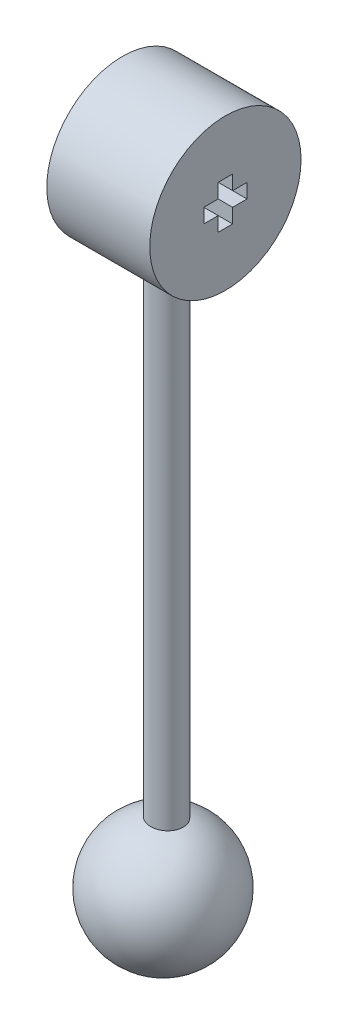
ISO-10303-21;
HEADER;
FILE_DESCRIPTION(('STEP AP214'),'2;1');
FILE_NAME('part.step','',(''),(''),'','','');
FILE_SCHEMA(('AUTOMOTIVE_DESIGN { 1 0 10303 214 1 1 1 1 }'));
ENDSEC;
DATA;
#1=APPLICATION_CONTEXT('core data for automotive mechanical design processes');
#2=APPLICATION_PROTOCOL_DEFINITION('international standard','automotive_design',2000,#1);
#3=PRODUCT_CONTEXT('',#1,'mechanical');
#4=PRODUCT('Part','Part','',(#3));
#5=PRODUCT_RELATED_PRODUCT_CATEGORY('part','',(#4));
#6=PRODUCT_DEFINITION_FORMATION('','',#4);
#7=PRODUCT_DEFINITION_CONTEXT('part definition',#1,'design');
#8=PRODUCT_DEFINITION('design','',#6,#7);
#9=PRODUCT_DEFINITION_SHAPE('','',#8);
#10=(LENGTH_UNIT() NAMED_UNIT(*) SI_UNIT(.MILLI.,.METRE.));
#11=(NAMED_UNIT(*) PLANE_ANGLE_UNIT() SI_UNIT($,.RADIAN.));
#12=(NAMED_UNIT(*) SI_UNIT($,.STERADIAN.) SOLID_ANGLE_UNIT());
#13=UNCERTAINTY_MEASURE_WITH_UNIT(LENGTH_MEASURE(1.E-05),#10,'distance_accuracy_value','');
#14=(GEOMETRIC_REPRESENTATION_CONTEXT(3) GLOBAL_UNCERTAINTY_ASSIGNED_CONTEXT((#13)) GLOBAL_UNIT_ASSIGNED_CONTEXT((#10,
#11,#12)) REPRESENTATION_CONTEXT('',''));
#15=CARTESIAN_POINT('',(0.,0.,0.));
#16=DIRECTION('',(0.,0.,1.));
#17=DIRECTION('',(1.,0.,0.));
#18=AXIS2_PLACEMENT_3D('',#15,#16,#17);
#19=CARTESIAN_POINT('',(-11.0722496385316,74.168,-21.5543244105927));
#20=DIRECTION('',(0.,-1.,0.));
#21=DIRECTION('',(0.,0.,-1.));
#22=AXIS2_PLACEMENT_3D('',#19,#20,#21);
#23=CYLINDRICAL_SURFACE('',#22,2.02572946275032);
#24=CARTESIAN_POINT('',(-12.4821164353175,7.6224074137577,-23.0089224552701));
#25=CARTESIAN_POINT('',(-12.5638423965474,7.62711954625664,-22.9297026989687));
#26=CARTESIAN_POINT('',(-12.6389387727303,7.6317342641124,-22.8435188043488));
#27=CARTESIAN_POINT('',(-12.7736573457487,7.64063602777816,-22.6596785154117));
#28=CARTESIAN_POINT('',(-12.8332608790463,7.64492267403114,-22.5620084879984));
#29=CARTESIAN_POINT('',(-12.935196267457,7.65304269814887,-22.3580620934006));
#30=CARTESIAN_POINT('',(-12.9775357963487,7.65687627686098,-22.2517895752194));
#31=CARTESIAN_POINT('',(-13.043750139669,7.66398397736629,-22.033653461523));
#32=CARTESIAN_POINT('',(-13.067629563174,7.66725823864943,-21.9217912690555));
#33=CARTESIAN_POINT('',(-13.0962498632644,7.67315616433629,-21.6956823191641));
#34=CARTESIAN_POINT('',(-13.1010000210248,7.675780143665,-21.5814367451666));
#35=CARTESIAN_POINT('',(-13.0912432020006,7.68030683834685,-21.3537520720783));
#36=CARTESIAN_POINT('',(-13.076735558985,7.6822095287438,-21.2403130010255));
#37=CARTESIAN_POINT('',(-13.0288895317924,7.68523949857679,-21.0175704455225));
#38=CARTESIAN_POINT('',(-12.9955674874739,7.68636744897449,-20.9082634602256));
#39=CARTESIAN_POINT('',(-12.9110477368848,7.68781942286316,-20.6967886649921));
#40=CARTESIAN_POINT('',(-12.8598501323067,7.68814345092747,-20.5946208144457));
#41=CARTESIAN_POINT('',(-12.7410651219781,7.68797868611838,-20.4003799705216));
#42=CARTESIAN_POINT('',(-12.6734864359791,7.68749032487672,-20.3083016441663));
#43=CARTESIAN_POINT('',(-12.5238453291869,7.68571508464123,-20.1367906777866));
#44=CARTESIAN_POINT('',(-12.4417829465696,7.68442820775208,-20.057358004432));
#45=CARTESIAN_POINT('',(-12.2655058308318,7.68109145534891,-19.9133887465834));
#46=CARTESIAN_POINT('',(-12.1712909943948,7.67904157334777,-19.8488522887456));
#47=CARTESIAN_POINT('',(-11.9733856177019,7.67423544826821,-19.7365011923586));
#48=CARTESIAN_POINT('',(-11.8696950462183,7.67147920286188,-19.6886866089196));
#49=CARTESIAN_POINT('',(-11.6557223004282,7.66533492041513,-19.6111061223166));
#50=CARTESIAN_POINT('',(-11.5454365634819,7.66194653976842,-19.5813500727215));
#51=CARTESIAN_POINT('',(-11.3214535468286,7.65463297711279,-19.5407625440552));
#52=CARTESIAN_POINT('',(-11.2077562534568,7.65070779295353,-19.5299311407956));
#53=CARTESIAN_POINT('',(-10.9800742250936,7.64242624992248,-19.527490478506));
#54=CARTESIAN_POINT('',(-10.8660893277451,7.63806952658417,-19.535897602565));
#55=CARTESIAN_POINT('',(-10.6411596654783,7.62904946110191,-19.5717224133296));
#56=CARTESIAN_POINT('',(-10.5302149152562,7.62438611747611,-19.5991401919171));
#57=CARTESIAN_POINT('',(-10.3144219479596,7.61487988748878,-19.6722339273317));
#58=CARTESIAN_POINT('',(-10.2095786403634,7.61003686154078,-19.7179243606366));
#59=CARTESIAN_POINT('',(-10.0090572031216,7.60031153439104,-19.8262652504825));
#60=CARTESIAN_POINT('',(-9.91337910018492,7.59542923307488,-19.8889157564461));
#61=CARTESIAN_POINT('',(-9.73386719890109,7.58576212186965,-20.029427908344));
#62=CARTESIAN_POINT('',(-9.65003802984346,7.58097735070623,-20.1072954713159));
#63=CARTESIAN_POINT('',(-9.49665088087891,7.57164409814127,-20.276018061785));
#64=CARTESIAN_POINT('',(-9.42709289973327,7.56709561671921,-20.366873088155));
#65=CARTESIAN_POINT('',(-9.30424065487672,7.55836671954665,-20.5589749687411));
#66=CARTESIAN_POINT('',(-9.2509432533397,7.55418623289461,-20.6602198129743));
#67=CARTESIAN_POINT('',(-9.16211569030104,7.54631344619923,-20.8702425606936));
#68=CARTESIAN_POINT('',(-9.12658546892084,7.54262114451066,-20.9790204387906));
#69=CARTESIAN_POINT('',(-9.07432939969227,7.53583475795514,-21.2009403590051));
#70=CARTESIAN_POINT('',(-9.05759038631371,7.53274025551707,-21.3140792881192));
#71=CARTESIAN_POINT('',(-9.04335665549502,7.5272368832621,-21.541577940737));
#72=CARTESIAN_POINT('',(-9.04586185056505,7.52482801032819,-21.6559376586882));
#73=CARTESIAN_POINT('',(-9.07004181037368,7.52076863370838,-21.8825213499259));
#74=CARTESIAN_POINT('',(-9.09169925906325,7.5191174470265,-21.9947471589308));
#75=CARTESIAN_POINT('',(-9.15354999341144,7.51661894110506,-22.2139783281134));
#76=CARTESIAN_POINT('',(-9.19374317729627,7.51577161745184,-22.3209837169513));
#77=CARTESIAN_POINT('',(-9.29149075329455,7.51490618407932,-22.5266580758729));
#78=CARTESIAN_POINT('',(-9.34903292516787,7.51488749205784,-22.6253328514361));
#79=CARTESIAN_POINT('',(-9.47985434473788,7.51567839852983,-22.8116278996702));
#80=CARTESIAN_POINT('',(-9.55313359033489,7.51648799691278,-22.8992481738159));
#81=CARTESIAN_POINT('',(-9.71333109526263,7.51891135305674,-23.0609329224399));
#82=CARTESIAN_POINT('',(-9.80024682391217,7.52052496172883,-23.1349999066461));
#83=CARTESIAN_POINT('',(-9.98525774710697,7.52450874881446,-23.2675012794572));
#84=CARTESIAN_POINT('',(-10.0833529807409,7.52687892987339,-23.3259356134008));
#85=CARTESIAN_POINT('',(-10.2879824453663,7.5323075167383,-23.4255430672766));
#86=CARTESIAN_POINT('',(-10.3945203459058,7.53536622288197,-23.4667086319886));
#87=CARTESIAN_POINT('',(-10.6129701023311,7.54208178977213,-23.5305813848089));
#88=CARTESIAN_POINT('',(-10.7248817694089,7.54573862951395,-23.5532892209306));
#89=CARTESIAN_POINT('',(-10.9509927645772,7.55354713879281,-23.5796247857204));
#90=CARTESIAN_POINT('',(-11.0651936936089,7.55769916543813,-23.5832386584889));
#91=CARTESIAN_POINT('',(-11.2925993070828,7.56637719285383,-23.5712506455019));
#92=CARTESIAN_POINT('',(-11.4058037320597,7.57090328801111,-23.5556438960051));
#93=CARTESIAN_POINT('',(-11.6281192008504,7.58020421432299,-23.5056300053598));
#94=CARTESIAN_POINT('',(-11.7372245318791,7.58497937196866,-23.4711975956907));
#95=CARTESIAN_POINT('',(-11.9480007488603,7.59463273665733,-23.3845144566691));
#96=CARTESIAN_POINT('',(-12.0496803779094,7.59951081350204,-23.332285106161));
#97=CARTESIAN_POINT('',(-12.2066160369226,7.60741149428279,-23.2341706354058));
#98=CARTESIAN_POINT('',(-12.2650136305271,7.61044582072619,-23.1932165531621));
#99=CARTESIAN_POINT('',(-12.377179249311,7.61646863186706,-23.105392470232));
#100=CARTESIAN_POINT('',(-12.4309472723515,7.61945711654337,-23.0585224668125));
#101=CARTESIAN_POINT('',(-12.4821164353175,7.6224074137577,-23.0089224552701));
#102=B_SPLINE_CURVE_WITH_KNOTS('',3,(#24,#25,#26,#27,#28,#29,#30,#31,#32,#33,#34,#35,#36,#37,
#38,#39,#40,#41,#42,#43,#44,#45,#46,#47,#48,#49,#50,#51,#52,#53,#54,#55,#56,#57,#58,#59,#60,#61,
#62,#63,#64,#65,#66,#67,#68,#69,#70,#71,#72,#73,#74,#75,#76,#77,#78,#79,#80,#81,#82,#83,#84,#85,
#86,#87,#88,#89,#90,#91,#92,#93,#94,#95,#96,#97,#98,#99,#100,#101),.UNSPECIFIED.,.T.,.F.,(4,2,2,
2,2,2,2,2,2,2,2,2,2,2,2,2,2,2,2,2,2,2,2,2,2,2,2,2,2,2,2,2,2,2,2,2,2,2,4),(0.,0.34149121521636,
0.683391922865119,1.02514049095714,1.36680370447542,1.70830112917593,2.04981036841789,
2.39102347023572,2.73223463095599,3.07326456017766,3.41429359053295,3.75532552040612,
4.09635857420648,4.43757754445413,4.7787978816139,5.12030890231436,5.46182157360905,
5.80360534539444,6.14539011316535,6.48730804675198,6.8292259506608,7.17107783241386,
7.51292856205714,7.85453963385242,8.19614915258422,8.53745012870706,8.87874923087752,
9.21980848899675,9.5608677016112,9.90186369459538,10.2428608798959,10.5840070989019,
10.9251413404386,11.2665230985936,11.6079912604955,11.9499188832369,12.2914371998815,
12.5052470016512,12.7190569022003),.UNSPECIFIED.);
#103=CARTESIAN_POINT('',(-12.4821164353175,7.6224074137577,-23.0089224552701));
#104=VERTEX_POINT('',#103);
#105=EDGE_CURVE('E229',#104,#104,#102,.T.);
#106=ORIENTED_EDGE('',*,*,#105,.T.);
#107=EDGE_LOOP('',(#106));
#108=FACE_BOUND('',#107,.T.);
#109=CARTESIAN_POINT('',(-11.0722496385316,67.7242169089415,-23.580053873343));
#110=CARTESIAN_POINT('',(-11.1845883612044,67.724214638846,-23.5800499806864));
#111=CARTESIAN_POINT('',(-11.2969740754876,67.7221165265859,-23.5706773219444));
#112=CARTESIAN_POINT('',(-11.5185510207202,67.7139659092303,-23.5334744459653));
#113=CARTESIAN_POINT('',(-11.6277398583732,67.7079105168597,-23.5056307518343));
#114=CARTESIAN_POINT('',(-11.8396857558684,67.6925627178645,-23.4324025302527));
#115=CARTESIAN_POINT('',(-11.9424496703365,67.6832738329878,-23.3870370807013));
#116=CARTESIAN_POINT('',(-12.1389098086265,67.6625099061851,-23.2801074877265));
#117=CARTESIAN_POINT('',(-12.2326062487158,67.6510349164191,-23.2185437307775));
#118=CARTESIAN_POINT('',(-12.4098322174115,67.6269784519804,-23.0798734186544));
#119=CARTESIAN_POINT('',(-12.4931889405506,67.6143830077749,-23.0025483969894));
#120=CARTESIAN_POINT('',(-12.6458562941506,67.589627183275,-22.8350221769775));
#121=CARTESIAN_POINT('',(-12.7151658431425,67.5774668365373,-22.7448199881488));
#122=CARTESIAN_POINT('',(-12.8384537468725,67.5547993536909,-22.5529426802655));
#123=CARTESIAN_POINT('',(-12.8922660807111,67.5443106216906,-22.4511585258061));
#124=CARTESIAN_POINT('',(-12.9819581788138,67.5263258789966,-22.2397263653375));
#125=CARTESIAN_POINT('',(-13.0178399239781,67.5188295377338,-22.1300792295305));
#126=CARTESIAN_POINT('',(-13.0701093130078,67.5077729258442,-21.9078300478554));
#127=CARTESIAN_POINT('',(-13.0867893604549,67.504153675686,-21.7952997541579));
#128=CARTESIAN_POINT('',(-13.1010959129492,67.5010547517967,-21.5689837874328));
#129=CARTESIAN_POINT('',(-13.0987245656993,67.5015746114552,-21.4551982573548));
#130=CARTESIAN_POINT('',(-13.0752137918608,67.5066501995593,-21.2316169125722));
#131=CARTESIAN_POINT('',(-13.0543895200586,67.5111381546512,-21.121786192921));
#132=CARTESIAN_POINT('',(-12.995066013139,67.5235685153916,-20.9072163607895));
#133=CARTESIAN_POINT('',(-12.9565659869448,67.5315110756498,-20.8024774764259));
#134=CARTESIAN_POINT('',(-12.8627038524144,67.5500674518694,-20.6001873457765));
#135=CARTESIAN_POINT('',(-12.8072219101778,67.5607001554113,-20.5026935056594));
#136=CARTESIAN_POINT('',(-12.6810601668257,67.5834703746893,-20.3182848819182));
#137=CARTESIAN_POINT('',(-12.6103783249948,67.5956080923937,-20.2313715212692));
#138=CARTESIAN_POINT('',(-12.4541061703012,67.6203466625691,-20.0687170076721));
#139=CARTESIAN_POINT('',(-12.3682400304646,67.6329519086925,-19.9932412966741));
#140=CARTESIAN_POINT('',(-12.1849392182354,67.6569715587754,-19.8577119863653));
#141=CARTESIAN_POINT('',(-12.0875042420013,67.6683859314433,-19.7976587922394));
#142=CARTESIAN_POINT('',(-11.8834068941629,67.6887427913179,-19.6945637212631));
#143=CARTESIAN_POINT('',(-11.7767187546139,67.6976780644646,-19.651571337537));
#144=CARTESIAN_POINT('',(-11.5573924857956,67.7119645792029,-19.5842048026585));
#145=CARTESIAN_POINT('',(-11.4447552873278,67.71731637969,-19.5598277480871));
#146=CARTESIAN_POINT('',(-11.219151881333,67.7237161946008,-19.5307941762343));
#147=CARTESIAN_POINT('',(-11.106237708823,67.7248484816802,-19.5257514513666));
#148=CARTESIAN_POINT('',(-10.8811820424108,67.7229082932674,-19.5344846626212));
#149=CARTESIAN_POINT('',(-10.7690404968195,67.7198361018561,-19.5482593273217));
#150=CARTESIAN_POINT('',(-10.5500537852391,67.7099126333532,-19.5939014182416));
#151=CARTESIAN_POINT('',(-10.4431622133197,67.7031056895605,-19.6255567203432));
#152=CARTESIAN_POINT('',(-10.2362001147538,67.6865195762689,-19.7058320957198));
#153=CARTESIAN_POINT('',(-10.1361302338023,67.6767401258897,-19.754453772259));
#154=CARTESIAN_POINT('',(-9.9439790784725,67.6551253561305,-19.8681347601941));
#155=CARTESIAN_POINT('',(-9.85204208672614,67.6432610891421,-19.9334323315014));
#156=CARTESIAN_POINT('',(-9.68028892834672,67.6188901185995,-20.0782992488178));
#157=CARTESIAN_POINT('',(-9.60047424492597,67.606383336681,-20.1578703386547));
#158=CARTESIAN_POINT('',(-9.45373552977528,67.5818591397067,-20.3307719246595));
#159=CARTESIAN_POINT('',(-9.38707460254791,67.5698548970058,-20.4243278971199));
#160=CARTESIAN_POINT('',(-9.27041573484677,67.547929454206,-20.6215344397434));
#161=CARTESIAN_POINT('',(-9.22041702267846,67.5380081576453,-20.7251845421192));
#162=CARTESIAN_POINT('',(-9.13886987230898,67.521422078045,-20.9389964853861));
#163=CARTESIAN_POINT('',(-9.10720559477892,67.5147368938676,-21.0491124912187));
#164=CARTESIAN_POINT('',(-9.06286386832617,67.5052881335313,-21.2732621537824));
#165=CARTESIAN_POINT('',(-9.05018370382146,67.5025239964891,-21.3872952478062));
#166=CARTESIAN_POINT('',(-9.04429067406729,67.5012451115381,-21.6135429929605));
#167=CARTESIAN_POINT('',(-9.05068473388677,67.502644560316,-21.7257471015227));
#168=CARTESIAN_POINT('',(-9.08188047775563,67.5093520879066,-21.9474408943459));
#169=CARTESIAN_POINT('',(-9.10668184073674,67.5146600985444,-22.0569306259178));
#170=CARTESIAN_POINT('',(-9.17380103347112,67.528582351397,-22.2697891167396));
#171=CARTESIAN_POINT('',(-9.21606390090289,67.5371862133619,-22.3731759289966));
#172=CARTESIAN_POINT('',(-9.31685251796394,67.5567807096875,-22.5714436664703));
#173=CARTESIAN_POINT('',(-9.37537981997752,67.5677715718574,-22.6663237786079));
#174=CARTESIAN_POINT('',(-9.50832176473615,67.5911972669218,-22.8468046436831));
#175=CARTESIAN_POINT('',(-9.58301328217531,67.6036552773598,-22.9321984618435));
#176=CARTESIAN_POINT('',(-9.74560397025006,67.6284851474938,-23.0893746372928));
#177=CARTESIAN_POINT('',(-9.83350631400841,67.640856985743,-23.1611537150471));
#178=CARTESIAN_POINT('',(-10.0214101666356,67.6642944626206,-23.2899690818343));
#179=CARTESIAN_POINT('',(-10.1215552912577,67.6753408333376,-23.3467995801119));
#180=CARTESIAN_POINT('',(-10.330192437704,67.6946350719407,-23.4427338701598));
#181=CARTESIAN_POINT('',(-10.4386772548005,67.7028853228144,-23.4818527662098));
#182=CARTESIAN_POINT('',(-10.6347796941244,67.7141164276749,-23.5342128965128));
#183=CARTESIAN_POINT('',(-10.7213281689145,67.717879127,-23.5513705053498));
#184=CARTESIAN_POINT('',(-10.8959913815776,67.7229301997577,-23.5742922517069));
#185=CARTESIAN_POINT('',(-10.9841060452399,67.7242186901116,-23.5800569276125));
#186=CARTESIAN_POINT('',(-11.0722496385316,67.7242169089415,-23.580053873343));
#187=B_SPLINE_CURVE_WITH_KNOTS('',3,(#109,#110,#111,#112,#113,#114,#115,#116,#117,#118,#119,
#120,#121,#122,#123,#124,#125,#126,#127,#128,#129,#130,#131,#132,#133,#134,#135,#136,#137,#138,
#139,#140,#141,#142,#143,#144,#145,#146,#147,#148,#149,#150,#151,#152,#153,#154,#155,#156,#157,
#158,#159,#160,#161,#162,#163,#164,#165,#166,#167,#168,#169,#170,#171,#172,#173,#174,#175,#176,
#177,#178,#179,#180,#181,#182,#183,#184,#185,#186),.UNSPECIFIED.,.T.,.F.,(4,2,2,2,2,2,2,2,2,2,2,
2,2,2,2,2,2,2,2,2,2,2,2,2,2,2,2,2,2,2,2,2,2,2,2,2,2,2,4),(0.,0.33669315718611,0.673632244062169,
1.01020549711112,1.34677072060881,1.68836418771724,2.02998394356962,2.37513780173853,
2.72025352024318,3.06004124076899,3.39979065686745,3.73384703236038,4.06791835997311,
4.40440366193191,4.7409341681298,5.08436095412644,5.42779676181023,5.77222171260797,
6.11659293272337,6.45404829340341,6.79148085459681,7.12499196722034,7.45853460403616,
7.79713909439498,8.13578498103307,8.48063828979525,8.82547562478599,9.16810976612567,
9.51069489068767,9.8462692401027,10.1818377364201,10.5163579389069,10.8509100811684,
11.1917244017453,11.5326207141016,11.8779897853453,12.223063771922,12.4872535948103,
12.7514309328199),.UNSPECIFIED.);
#188=CARTESIAN_POINT('',(-11.0722496385316,67.7242169089415,-23.580053873343));
#189=VERTEX_POINT('',#188);
#190=EDGE_CURVE('E11',#189,#189,#187,.T.);
#191=ORIENTED_EDGE('',*,*,#190,.F.);
#192=EDGE_LOOP('',(#191));
#193=FACE_BOUND('',#192,.T.);
#194=ADVANCED_FACE('F41',(#108,#193),#23,.T.);
#195=CARTESIAN_POINT('',(-11.3521452670296,0.,-21.3896799232409));
#196=DIRECTION('',(-0.707106781186548,0.,-0.707106781186548));
#197=DIRECTION('',(0.707106781186548,0.,-0.707106781186548));
#198=AXIS2_PLACEMENT_3D('',#195,#196,#197);
#199=SPHERICAL_SURFACE('',#198,7.874);
#200=ORIENTED_EDGE('',*,*,#105,.F.);
#201=EDGE_LOOP('',(#200));
#202=FACE_BOUND('',#201,.T.);
#203=ADVANCED_FACE('F43',(#202),#199,.T.);
#204=CARTESIAN_POINT('',(-3.81,76.835,-21.5543244105927));
#205=DIRECTION('',(-1.,0.,0.));
#206=DIRECTION('',(0.,0.,1.));
#207=AXIS2_PLACEMENT_3D('',#204,#205,#206);
#208=CYLINDRICAL_SURFACE('',#207,9.33327104441805);
#209=CARTESIAN_POINT('',(-16.51,76.835,-21.5543244105927));
#210=DIRECTION('',(1.,0.,0.));
#211=DIRECTION('',(0.,0.,-1.));
#212=AXIS2_PLACEMENT_3D('',#209,#210,#211);
#213=CIRCLE('',#212,9.33327104441805);
#214=CARTESIAN_POINT('',(-16.51,76.835,-30.8875954550107));
#215=VERTEX_POINT('',#214);
#216=EDGE_CURVE('E225',#215,#215,#213,.T.);
#217=ORIENTED_EDGE('',*,*,#216,.T.);
#218=EDGE_LOOP('',(#217));
#219=FACE_BOUND('',#218,.T.);
#220=CARTESIAN_POINT('',(-3.81,76.835,-21.5543244105927));
#221=DIRECTION('',(1.,0.,0.));
#222=DIRECTION('',(0.,0.,-1.));
#223=AXIS2_PLACEMENT_3D('',#220,#221,#222);
#224=CIRCLE('',#223,9.33327104441805);
#225=CARTESIAN_POINT('',(-3.81,76.835,-30.8875954550107));
#226=VERTEX_POINT('',#225);
#227=EDGE_CURVE('E226',#226,#226,#224,.T.);
#228=ORIENTED_EDGE('',*,*,#227,.F.);
#229=EDGE_LOOP('',(#228));
#230=FACE_BOUND('',#229,.T.);
#231=ORIENTED_EDGE('',*,*,#190,.T.);
#232=EDGE_LOOP('',(#231));
#233=FACE_BOUND('',#232,.T.);
#234=ADVANCED_FACE('F244',(#219,#230,#233),#208,.T.);
#235=CARTESIAN_POINT('',(-3.81,76.835,-21.5543244105927));
#236=DIRECTION('',(1.,0.,0.));
#237=DIRECTION('',(0.,0.,-1.));
#238=AXIS2_PLACEMENT_3D('',#235,#236,#237);
#239=PLANE('',#238);
#240=ORIENTED_EDGE('',*,*,#227,.T.);
#241=EDGE_LOOP('',(#240));
#242=FACE_BOUND('',#241,.T.);
#243=DIRECTION('',(0.,0.,-1.));
#244=VECTOR('',#243,1.);
#245=CARTESIAN_POINT('',(-3.81,74.168,-22.4433244105927));
#246=LINE('',#245,#244);
#247=CARTESIAN_POINT('',(-3.81,74.168,-20.6653244105927));
#248=VERTEX_POINT('',#247);
#249=CARTESIAN_POINT('',(-3.81,74.168,-22.4433244105927));
#250=VERTEX_POINT('',#249);
#251=EDGE_CURVE('E139',#248,#250,#246,.T.);
#252=ORIENTED_EDGE('',*,*,#251,.F.);
#253=DIRECTION('',(0.,-1.,0.));
#254=VECTOR('',#253,1.);
#255=CARTESIAN_POINT('',(-3.81,75.946,-20.6653244105927));
#256=LINE('',#255,#254);
#257=CARTESIAN_POINT('',(-3.81,75.946,-20.6653244105927));
#258=VERTEX_POINT('',#257);
#259=EDGE_CURVE('E145',#258,#248,#256,.T.);
#260=ORIENTED_EDGE('',*,*,#259,.F.);
#261=DIRECTION('',(0.,0.,-1.));
#262=VECTOR('',#261,1.);
#263=CARTESIAN_POINT('',(-3.81,75.946,-18.8873244105927));
#264=LINE('',#263,#262);
#265=CARTESIAN_POINT('',(-3.81,75.946,-18.8873244105927));
#266=VERTEX_POINT('',#265);
#267=EDGE_CURVE('E174',#266,#258,#264,.T.);
#268=ORIENTED_EDGE('',*,*,#267,.F.);
#269=DIRECTION('',(0.,-1.,0.));
#270=VECTOR('',#269,1.);
#271=CARTESIAN_POINT('',(-3.81,77.724,-18.8873244105927));
#272=LINE('',#271,#270);
#273=CARTESIAN_POINT('',(-3.81,77.724,-18.8873244105927));
#274=VERTEX_POINT('',#273);
#275=EDGE_CURVE('E172',#274,#266,#272,.T.);
#276=ORIENTED_EDGE('',*,*,#275,.F.);
#277=DIRECTION('',(0.,0.,1.));
#278=VECTOR('',#277,1.);
#279=CARTESIAN_POINT('',(-3.81,77.724,-18.8873244105927));
#280=LINE('',#279,#278);
#281=CARTESIAN_POINT('',(-3.81,77.724,-20.6653244105927));
#282=VERTEX_POINT('',#281);
#283=EDGE_CURVE('E170',#282,#274,#280,.T.);
#284=ORIENTED_EDGE('',*,*,#283,.F.);
#285=DIRECTION('',(0.,-1.,0.));
#286=VECTOR('',#285,1.);
#287=CARTESIAN_POINT('',(-3.81,79.502,-20.6653244105927));
#288=LINE('',#287,#286);
#289=CARTESIAN_POINT('',(-3.81,79.502,-20.6653244105927));
#290=VERTEX_POINT('',#289);
#291=EDGE_CURVE('E168',#290,#282,#288,.T.);
#292=ORIENTED_EDGE('',*,*,#291,.F.);
#293=DIRECTION('',(0.,0.,1.));
#294=VECTOR('',#293,1.);
#295=CARTESIAN_POINT('',(-3.81,79.502,-22.4433244105927));
#296=LINE('',#295,#294);
#297=CARTESIAN_POINT('',(-3.81,79.502,-22.4433244105927));
#298=VERTEX_POINT('',#297);
#299=EDGE_CURVE('E166',#298,#290,#296,.T.);
#300=ORIENTED_EDGE('',*,*,#299,.F.);
#301=DIRECTION('',(0.,1.,0.));
#302=VECTOR('',#301,1.);
#303=CARTESIAN_POINT('',(-3.81,79.502,-22.4433244105927));
#304=LINE('',#303,#302);
#305=CARTESIAN_POINT('',(-3.81,77.724,-22.4433244105927));
#306=VERTEX_POINT('',#305);
#307=EDGE_CURVE('E164',#306,#298,#304,.T.);
#308=ORIENTED_EDGE('',*,*,#307,.F.);
#309=DIRECTION('',(0.,0.,1.));
#310=VECTOR('',#309,1.);
#311=CARTESIAN_POINT('',(-3.81,77.724,-22.4433244105927));
#312=LINE('',#311,#310);
#313=CARTESIAN_POINT('',(-3.81,77.724,-24.2213244105927));
#314=VERTEX_POINT('',#313);
#315=EDGE_CURVE('E162',#314,#306,#312,.T.);
#316=ORIENTED_EDGE('',*,*,#315,.F.);
#317=DIRECTION('',(0.,1.,0.));
#318=VECTOR('',#317,1.);
#319=CARTESIAN_POINT('',(-3.81,77.724,-24.2213244105927));
#320=LINE('',#319,#318);
#321=CARTESIAN_POINT('',(-3.81,75.946,-24.2213244105927));
#322=VERTEX_POINT('',#321);
#323=EDGE_CURVE('E160',#322,#314,#320,.T.);
#324=ORIENTED_EDGE('',*,*,#323,.F.);
#325=DIRECTION('',(0.,0.,-1.));
#326=VECTOR('',#325,1.);
#327=CARTESIAN_POINT('',(-3.81,75.946,-22.4433244105927));
#328=LINE('',#327,#326);
#329=CARTESIAN_POINT('',(-3.81,75.946,-22.4433244105927));
#330=VERTEX_POINT('',#329);
#331=EDGE_CURVE('E156',#330,#322,#328,.T.);
#332=ORIENTED_EDGE('',*,*,#331,.F.);
#333=DIRECTION('',(0.,1.,0.));
#334=VECTOR('',#333,1.);
#335=CARTESIAN_POINT('',(-3.81,75.946,-22.4433244105927));
#336=LINE('',#335,#334);
#337=EDGE_CURVE('E154',#250,#330,#336,.T.);
#338=ORIENTED_EDGE('',*,*,#337,.F.);
#339=EDGE_LOOP('',(#252,#260,#268,#276,#284,#292,#300,#308,#316,#324,#332,#338));
#340=FACE_BOUND('',#339,.T.);
#341=ADVANCED_FACE('F152',(#242,#340),#239,.T.);
#342=CARTESIAN_POINT('',(-16.51,76.835,-21.5543244105927));
#343=DIRECTION('',(1.,0.,0.));
#344=DIRECTION('',(0.,0.,-1.));
#345=AXIS2_PLACEMENT_3D('',#342,#343,#344);
#346=PLANE('',#345);
#347=ORIENTED_EDGE('',*,*,#216,.F.);
#348=EDGE_LOOP('',(#347));
#349=FACE_BOUND('',#348,.T.);
#350=DIRECTION('',(0.,-1.,0.));
#351=VECTOR('',#350,1.);
#352=CARTESIAN_POINT('',(-16.51,75.946,-20.6653244105927));
#353=LINE('',#352,#351);
#354=CARTESIAN_POINT('',(-16.51,75.946,-20.6653244105927));
#355=VERTEX_POINT('',#354);
#356=CARTESIAN_POINT('',(-16.51,74.168,-20.6653244105927));
#357=VERTEX_POINT('',#356);
#358=EDGE_CURVE('E69',#355,#357,#353,.T.);
#359=ORIENTED_EDGE('',*,*,#358,.T.);
#360=DIRECTION('',(0.,0.,-1.));
#361=VECTOR('',#360,1.);
#362=CARTESIAN_POINT('',(-16.51,74.168,-22.4433244105927));
#363=LINE('',#362,#361);
#364=CARTESIAN_POINT('',(-16.51,74.168,-22.4433244105927));
#365=VERTEX_POINT('',#364);
#366=EDGE_CURVE('E142',#357,#365,#363,.T.);
#367=ORIENTED_EDGE('',*,*,#366,.T.);
#368=DIRECTION('',(0.,1.,0.));
#369=VECTOR('',#368,1.);
#370=CARTESIAN_POINT('',(-16.51,75.946,-22.4433244105927));
#371=LINE('',#370,#369);
#372=CARTESIAN_POINT('',(-16.51,75.946,-22.4433244105927));
#373=VERTEX_POINT('',#372);
#374=EDGE_CURVE('E178',#365,#373,#371,.T.);
#375=ORIENTED_EDGE('',*,*,#374,.T.);
#376=DIRECTION('',(0.,0.,-1.));
#377=VECTOR('',#376,1.);
#378=CARTESIAN_POINT('',(-16.51,75.946,-22.4433244105927));
#379=LINE('',#378,#377);
#380=CARTESIAN_POINT('',(-16.51,75.946,-24.2213244105927));
#381=VERTEX_POINT('',#380);
#382=EDGE_CURVE('E181',#373,#381,#379,.T.);
#383=ORIENTED_EDGE('',*,*,#382,.T.);
#384=DIRECTION('',(0.,1.,0.));
#385=VECTOR('',#384,1.);
#386=CARTESIAN_POINT('',(-16.51,77.724,-24.2213244105927));
#387=LINE('',#386,#385);
#388=CARTESIAN_POINT('',(-16.51,77.724,-24.2213244105927));
#389=VERTEX_POINT('',#388);
#390=EDGE_CURVE('E184',#381,#389,#387,.T.);
#391=ORIENTED_EDGE('',*,*,#390,.T.);
#392=DIRECTION('',(0.,0.,1.));
#393=VECTOR('',#392,1.);
#394=CARTESIAN_POINT('',(-16.51,77.724,-22.4433244105927));
#395=LINE('',#394,#393);
#396=CARTESIAN_POINT('',(-16.51,77.724,-22.4433244105927));
#397=VERTEX_POINT('',#396);
#398=EDGE_CURVE('E187',#389,#397,#395,.T.);
#399=ORIENTED_EDGE('',*,*,#398,.T.);
#400=DIRECTION('',(0.,1.,0.));
#401=VECTOR('',#400,1.);
#402=CARTESIAN_POINT('',(-16.51,79.502,-22.4433244105927));
#403=LINE('',#402,#401);
#404=CARTESIAN_POINT('',(-16.51,79.502,-22.4433244105927));
#405=VERTEX_POINT('',#404);
#406=EDGE_CURVE('E190',#397,#405,#403,.T.);
#407=ORIENTED_EDGE('',*,*,#406,.T.);
#408=DIRECTION('',(0.,0.,1.));
#409=VECTOR('',#408,1.);
#410=CARTESIAN_POINT('',(-16.51,79.502,-22.4433244105927));
#411=LINE('',#410,#409);
#412=CARTESIAN_POINT('',(-16.51,79.502,-20.6653244105927));
#413=VERTEX_POINT('',#412);
#414=EDGE_CURVE('E193',#405,#413,#411,.T.);
#415=ORIENTED_EDGE('',*,*,#414,.T.);
#416=DIRECTION('',(0.,-1.,0.));
#417=VECTOR('',#416,1.);
#418=CARTESIAN_POINT('',(-16.51,79.502,-20.6653244105927));
#419=LINE('',#418,#417);
#420=CARTESIAN_POINT('',(-16.51,77.724,-20.6653244105927));
#421=VERTEX_POINT('',#420);
#422=EDGE_CURVE('E196',#413,#421,#419,.T.);
#423=ORIENTED_EDGE('',*,*,#422,.T.);
#424=DIRECTION('',(0.,0.,1.));
#425=VECTOR('',#424,1.);
#426=CARTESIAN_POINT('',(-16.51,77.724,-18.8873244105927));
#427=LINE('',#426,#425);
#428=CARTESIAN_POINT('',(-16.51,77.724,-18.8873244105927));
#429=VERTEX_POINT('',#428);
#430=EDGE_CURVE('E199',#421,#429,#427,.T.);
#431=ORIENTED_EDGE('',*,*,#430,.T.);
#432=DIRECTION('',(0.,-1.,0.));
#433=VECTOR('',#432,1.);
#434=CARTESIAN_POINT('',(-16.51,77.724,-18.8873244105927));
#435=LINE('',#434,#433);
#436=CARTESIAN_POINT('',(-16.51,75.946,-18.8873244105927));
#437=VERTEX_POINT('',#436);
#438=EDGE_CURVE('E202',#429,#437,#435,.T.);
#439=ORIENTED_EDGE('',*,*,#438,.T.);
#440=DIRECTION('',(0.,0.,-1.));
#441=VECTOR('',#440,1.);
#442=CARTESIAN_POINT('',(-16.51,75.946,-18.8873244105927));
#443=LINE('',#442,#441);
#444=EDGE_CURVE('E150',#437,#355,#443,.T.);
#445=ORIENTED_EDGE('',*,*,#444,.T.);
#446=EDGE_LOOP('',(#359,#367,#375,#383,#391,#399,#407,#415,#423,#431,#439,#445));
#447=FACE_BOUND('',#446,.T.);
#448=ADVANCED_FACE('F249',(#349,#447),#346,.F.);
#449=CARTESIAN_POINT('',(-3.81,75.946,-20.6653244105927));
#450=DIRECTION('',(0.,0.,-1.));
#451=DIRECTION('',(0.,1.,0.));
#452=AXIS2_PLACEMENT_3D('',#449,#450,#451);
#453=PLANE('',#452);
#454=ORIENTED_EDGE('',*,*,#358,.F.);
#455=DIRECTION('',(-1.,0.,0.));
#456=VECTOR('',#455,1.);
#457=CARTESIAN_POINT('',(-3.81,75.946,-20.6653244105927));
#458=LINE('',#457,#456);
#459=EDGE_CURVE('E147',#258,#355,#458,.T.);
#460=ORIENTED_EDGE('',*,*,#459,.F.);
#461=ORIENTED_EDGE('',*,*,#259,.T.);
#462=DIRECTION('',(-1.,0.,0.));
#463=VECTOR('',#462,1.);
#464=CARTESIAN_POINT('',(-11.0722496385316,74.168,-20.6653244105927));
#465=LINE('',#464,#463);
#466=EDGE_CURVE('E54',#248,#357,#465,.T.);
#467=ORIENTED_EDGE('',*,*,#466,.T.);
#468=EDGE_LOOP('',(#454,#460,#461,#467));
#469=FACE_BOUND('',#468,.T.);
#470=ADVANCED_FACE('F146',(#469),#453,.T.);
#471=CARTESIAN_POINT('',(-3.81,75.946,-22.4433244105927));
#472=DIRECTION('',(0.,0.,1.));
#473=DIRECTION('',(0.,-1.,0.));
#474=AXIS2_PLACEMENT_3D('',#471,#472,#473);
#475=PLANE('',#474);
#476=ORIENTED_EDGE('',*,*,#374,.F.);
#477=DIRECTION('',(1.,0.,0.));
#478=VECTOR('',#477,1.);
#479=CARTESIAN_POINT('',(-11.0722496385316,74.168,-22.4433244105927));
#480=LINE('',#479,#478);
#481=EDGE_CURVE('E143',#365,#250,#480,.T.);
#482=ORIENTED_EDGE('',*,*,#481,.T.);
#483=ORIENTED_EDGE('',*,*,#337,.T.);
#484=DIRECTION('',(-1.,0.,0.));
#485=VECTOR('',#484,1.);
#486=CARTESIAN_POINT('',(-3.81,75.946,-22.4433244105927));
#487=LINE('',#486,#485);
#488=EDGE_CURVE('E223',#330,#373,#487,.T.);
#489=ORIENTED_EDGE('',*,*,#488,.T.);
#490=EDGE_LOOP('',(#476,#482,#483,#489));
#491=FACE_BOUND('',#490,.T.);
#492=ADVANCED_FACE('F258',(#491),#475,.T.);
#493=CARTESIAN_POINT('',(-3.81,75.946,-22.4433244105927));
#494=DIRECTION('',(0.,1.,0.));
#495=DIRECTION('',(0.,0.,1.));
#496=AXIS2_PLACEMENT_3D('',#493,#494,#495);
#497=PLANE('',#496);
#498=ORIENTED_EDGE('',*,*,#382,.F.);
#499=ORIENTED_EDGE('',*,*,#488,.F.);
#500=ORIENTED_EDGE('',*,*,#331,.T.);
#501=DIRECTION('',(-1.,0.,0.));
#502=VECTOR('',#501,1.);
#503=CARTESIAN_POINT('',(-3.81,75.946,-24.2213244105927));
#504=LINE('',#503,#502);
#505=EDGE_CURVE('E221',#322,#381,#504,.T.);
#506=ORIENTED_EDGE('',*,*,#505,.T.);
#507=EDGE_LOOP('',(#498,#499,#500,#506));
#508=FACE_BOUND('',#507,.T.);
#509=ADVANCED_FACE('F261',(#508),#497,.T.);
#510=CARTESIAN_POINT('',(-3.81,77.724,-24.2213244105927));
#511=DIRECTION('',(0.,0.,1.));
#512=DIRECTION('',(1.,0.,0.));
#513=AXIS2_PLACEMENT_3D('',#510,#511,#512);
#514=PLANE('',#513);
#515=ORIENTED_EDGE('',*,*,#390,.F.);
#516=ORIENTED_EDGE('',*,*,#505,.F.);
#517=ORIENTED_EDGE('',*,*,#323,.T.);
#518=DIRECTION('',(-1.,0.,0.));
#519=VECTOR('',#518,1.);
#520=CARTESIAN_POINT('',(-3.81,77.724,-24.2213244105927));
#521=LINE('',#520,#519);
#522=EDGE_CURVE('E219',#314,#389,#521,.T.);
#523=ORIENTED_EDGE('',*,*,#522,.T.);
#524=EDGE_LOOP('',(#515,#516,#517,#523));
#525=FACE_BOUND('',#524,.T.);
#526=ADVANCED_FACE('F265',(#525),#514,.T.);
#527=CARTESIAN_POINT('',(-3.81,77.724,-22.4433244105927));
#528=DIRECTION('',(0.,-1.,0.));
#529=DIRECTION('',(0.,0.,-1.));
#530=AXIS2_PLACEMENT_3D('',#527,#528,#529);
#531=PLANE('',#530);
#532=ORIENTED_EDGE('',*,*,#398,.F.);
#533=ORIENTED_EDGE('',*,*,#522,.F.);
#534=ORIENTED_EDGE('',*,*,#315,.T.);
#535=DIRECTION('',(-1.,0.,0.));
#536=VECTOR('',#535,1.);
#537=CARTESIAN_POINT('',(-3.81,77.724,-22.4433244105927));
#538=LINE('',#537,#536);
#539=EDGE_CURVE('E217',#306,#397,#538,.T.);
#540=ORIENTED_EDGE('',*,*,#539,.T.);
#541=EDGE_LOOP('',(#532,#533,#534,#540));
#542=FACE_BOUND('',#541,.T.);
#543=ADVANCED_FACE('F269',(#542),#531,.T.);
#544=CARTESIAN_POINT('',(-3.81,79.502,-22.4433244105927));
#545=DIRECTION('',(0.,0.,1.));
#546=DIRECTION('',(1.,0.,0.));
#547=AXIS2_PLACEMENT_3D('',#544,#545,#546);
#548=PLANE('',#547);
#549=ORIENTED_EDGE('',*,*,#406,.F.);
#550=ORIENTED_EDGE('',*,*,#539,.F.);
#551=ORIENTED_EDGE('',*,*,#307,.T.);
#552=DIRECTION('',(-1.,0.,0.));
#553=VECTOR('',#552,1.);
#554=CARTESIAN_POINT('',(-3.81,79.502,-22.4433244105927));
#555=LINE('',#554,#553);
#556=EDGE_CURVE('E215',#298,#405,#555,.T.);
#557=ORIENTED_EDGE('',*,*,#556,.T.);
#558=EDGE_LOOP('',(#549,#550,#551,#557));
#559=FACE_BOUND('',#558,.T.);
#560=ADVANCED_FACE('F273',(#559),#548,.T.);
#561=CARTESIAN_POINT('',(-3.81,79.502,-22.4433244105927));
#562=DIRECTION('',(0.,-1.,0.));
#563=DIRECTION('',(0.,0.,-1.));
#564=AXIS2_PLACEMENT_3D('',#561,#562,#563);
#565=PLANE('',#564);
#566=ORIENTED_EDGE('',*,*,#414,.F.);
#567=ORIENTED_EDGE('',*,*,#556,.F.);
#568=ORIENTED_EDGE('',*,*,#299,.T.);
#569=DIRECTION('',(-1.,0.,0.));
#570=VECTOR('',#569,1.);
#571=CARTESIAN_POINT('',(-3.81,79.502,-20.6653244105927));
#572=LINE('',#571,#570);
#573=EDGE_CURVE('E213',#290,#413,#572,.T.);
#574=ORIENTED_EDGE('',*,*,#573,.T.);
#575=EDGE_LOOP('',(#566,#567,#568,#574));
#576=FACE_BOUND('',#575,.T.);
#577=ADVANCED_FACE('F277',(#576),#565,.T.);
#578=CARTESIAN_POINT('',(-3.81,79.502,-20.6653244105927));
#579=DIRECTION('',(0.,0.,-1.));
#580=DIRECTION('',(-1.,0.,0.));
#581=AXIS2_PLACEMENT_3D('',#578,#579,#580);
#582=PLANE('',#581);
#583=ORIENTED_EDGE('',*,*,#422,.F.);
#584=ORIENTED_EDGE('',*,*,#573,.F.);
#585=ORIENTED_EDGE('',*,*,#291,.T.);
#586=DIRECTION('',(-1.,0.,0.));
#587=VECTOR('',#586,1.);
#588=CARTESIAN_POINT('',(-3.81,77.724,-20.6653244105927));
#589=LINE('',#588,#587);
#590=EDGE_CURVE('E211',#282,#421,#589,.T.);
#591=ORIENTED_EDGE('',*,*,#590,.T.);
#592=EDGE_LOOP('',(#583,#584,#585,#591));
#593=FACE_BOUND('',#592,.T.);
#594=ADVANCED_FACE('F281',(#593),#582,.T.);
#595=CARTESIAN_POINT('',(-3.81,77.724,-18.8873244105927));
#596=DIRECTION('',(0.,-1.,0.));
#597=DIRECTION('',(0.,0.,-1.));
#598=AXIS2_PLACEMENT_3D('',#595,#596,#597);
#599=PLANE('',#598);
#600=ORIENTED_EDGE('',*,*,#430,.F.);
#601=ORIENTED_EDGE('',*,*,#590,.F.);
#602=ORIENTED_EDGE('',*,*,#283,.T.);
#603=DIRECTION('',(-1.,0.,0.));
#604=VECTOR('',#603,1.);
#605=CARTESIAN_POINT('',(-3.81,77.724,-18.8873244105927));
#606=LINE('',#605,#604);
#607=EDGE_CURVE('E209',#274,#429,#606,.T.);
#608=ORIENTED_EDGE('',*,*,#607,.T.);
#609=EDGE_LOOP('',(#600,#601,#602,#608));
#610=FACE_BOUND('',#609,.T.);
#611=ADVANCED_FACE('F285',(#610),#599,.T.);
#612=CARTESIAN_POINT('',(-3.81,77.724,-18.8873244105927));
#613=DIRECTION('',(0.,0.,-1.));
#614=DIRECTION('',(-1.,0.,0.));
#615=AXIS2_PLACEMENT_3D('',#612,#613,#614);
#616=PLANE('',#615);
#617=ORIENTED_EDGE('',*,*,#438,.F.);
#618=ORIENTED_EDGE('',*,*,#607,.F.);
#619=ORIENTED_EDGE('',*,*,#275,.T.);
#620=DIRECTION('',(-1.,0.,0.));
#621=VECTOR('',#620,1.);
#622=CARTESIAN_POINT('',(-3.81,75.946,-18.8873244105927));
#623=LINE('',#622,#621);
#624=EDGE_CURVE('E61',#266,#437,#623,.T.);
#625=ORIENTED_EDGE('',*,*,#624,.T.);
#626=EDGE_LOOP('',(#617,#618,#619,#625));
#627=FACE_BOUND('',#626,.T.);
#628=ADVANCED_FACE('F289',(#627),#616,.T.);
#629=CARTESIAN_POINT('',(-3.81,75.946,-18.8873244105927));
#630=DIRECTION('',(0.,1.,0.));
#631=DIRECTION('',(0.,0.,1.));
#632=AXIS2_PLACEMENT_3D('',#629,#630,#631);
#633=PLANE('',#632);
#634=ORIENTED_EDGE('',*,*,#444,.F.);
#635=ORIENTED_EDGE('',*,*,#624,.F.);
#636=ORIENTED_EDGE('',*,*,#267,.T.);
#637=ORIENTED_EDGE('',*,*,#459,.T.);
#638=EDGE_LOOP('',(#634,#635,#636,#637));
#639=FACE_BOUND('',#638,.T.);
#640=ADVANCED_FACE('F243',(#639),#633,.T.);
#641=CARTESIAN_POINT('',(-11.0722496385316,74.168,-21.5543244105927));
#642=DIRECTION('',(0.,1.,0.));
#643=DIRECTION('',(0.,0.,1.));
#644=AXIS2_PLACEMENT_3D('',#641,#642,#643);
#645=PLANE('',#644);
#646=ORIENTED_EDGE('',*,*,#466,.F.);
#647=ORIENTED_EDGE('',*,*,#251,.T.);
#648=ORIENTED_EDGE('',*,*,#481,.F.);
#649=ORIENTED_EDGE('',*,*,#366,.F.);
#650=EDGE_LOOP('',(#646,#647,#648,#649));
#651=FACE_BOUND('',#650,.T.);
#652=ADVANCED_FACE('F137',(#651),#645,.T.);
#653=CLOSED_SHELL('',(#194,#203,#234,#341,#448,#470,#492,#509,#526,#543,#560,#577,#594,#611,
#628,#640,#652));
#654=MANIFOLD_SOLID_BREP('B2',#653);
#655=ADVANCED_BREP_SHAPE_REPRESENTATION('',(#18,#654),#14);
#656=SHAPE_DEFINITION_REPRESENTATION(#9,#655);
ENDSEC;
END-ISO-10303-21;
